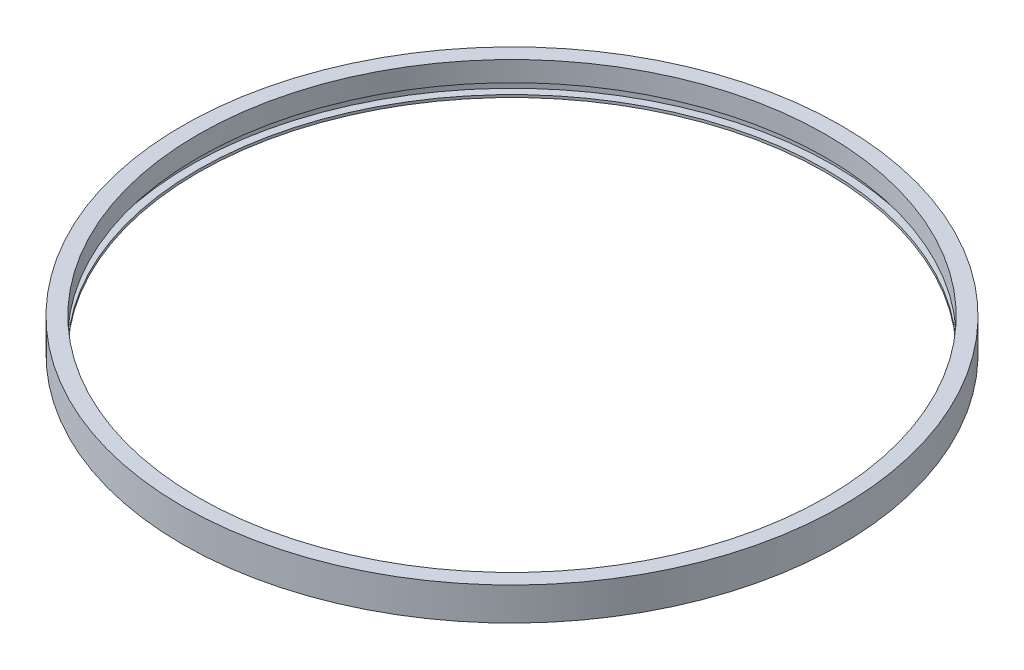
ISO-10303-21;
HEADER;
FILE_DESCRIPTION(('STEP AP214'),'2;1');
FILE_NAME('part.step','',(''),(''),'','','');
FILE_SCHEMA(('AUTOMOTIVE_DESIGN { 1 0 10303 214 1 1 1 1 }'));
ENDSEC;
DATA;
#1=APPLICATION_CONTEXT('core data for automotive mechanical design processes');
#2=APPLICATION_PROTOCOL_DEFINITION('international standard','automotive_design',2000,#1);
#3=PRODUCT_CONTEXT('',#1,'mechanical');
#4=PRODUCT('Part','Part','',(#3));
#5=PRODUCT_RELATED_PRODUCT_CATEGORY('part','',(#4));
#6=PRODUCT_DEFINITION_FORMATION('','',#4);
#7=PRODUCT_DEFINITION_CONTEXT('part definition',#1,'design');
#8=PRODUCT_DEFINITION('design','',#6,#7);
#9=PRODUCT_DEFINITION_SHAPE('','',#8);
#10=(LENGTH_UNIT() NAMED_UNIT(*) SI_UNIT(.MILLI.,.METRE.));
#11=(NAMED_UNIT(*) PLANE_ANGLE_UNIT() SI_UNIT($,.RADIAN.));
#12=(NAMED_UNIT(*) SI_UNIT($,.STERADIAN.) SOLID_ANGLE_UNIT());
#13=UNCERTAINTY_MEASURE_WITH_UNIT(LENGTH_MEASURE(1.E-05),#10,'distance_accuracy_value','');
#14=(GEOMETRIC_REPRESENTATION_CONTEXT(3) GLOBAL_UNCERTAINTY_ASSIGNED_CONTEXT((#13)) GLOBAL_UNIT_ASSIGNED_CONTEXT((#10,
#11,#12)) REPRESENTATION_CONTEXT('',''));
#15=CARTESIAN_POINT('',(0.,0.,0.));
#16=DIRECTION('',(0.,0.,1.));
#17=DIRECTION('',(1.,0.,0.));
#18=AXIS2_PLACEMENT_3D('',#15,#16,#17);
#19=CARTESIAN_POINT('',(0.,0.,0.));
#20=DIRECTION('',(0.,1.,0.));
#21=DIRECTION('',(0.,0.,1.));
#22=AXIS2_PLACEMENT_3D('',#19,#20,#21);
#23=PLANE('',#22);
#24=CARTESIAN_POINT('',(0.,0.,0.));
#25=DIRECTION('',(0.,1.,0.));
#26=DIRECTION('',(0.,0.,1.));
#27=AXIS2_PLACEMENT_3D('',#24,#25,#26);
#28=CIRCLE('',#27,61.);
#29=CARTESIAN_POINT('',(0.,0.,61.));
#30=VERTEX_POINT('',#29);
#31=EDGE_CURVE('E47',#30,#30,#28,.T.);
#32=ORIENTED_EDGE('',*,*,#31,.T.);
#33=EDGE_LOOP('',(#32));
#34=FACE_BOUND('',#33,.T.);
#35=CARTESIAN_POINT('',(0.,0.,0.));
#36=DIRECTION('',(0.,-1.,0.));
#37=DIRECTION('',(0.,0.,-1.));
#38=AXIS2_PLACEMENT_3D('',#35,#36,#37);
#39=CIRCLE('',#38,62.5);
#40=CARTESIAN_POINT('',(0.,0.,-62.5));
#41=VERTEX_POINT('',#40);
#42=EDGE_CURVE('E52',#41,#41,#39,.T.);
#43=ORIENTED_EDGE('',*,*,#42,.T.);
#44=EDGE_LOOP('',(#43));
#45=FACE_BOUND('',#44,.T.);
#46=ADVANCED_FACE('F36',(#34,#45),#23,.F.);
#47=CARTESIAN_POINT('',(0.,3.9,0.));
#48=DIRECTION('',(0.,1.,0.));
#49=DIRECTION('',(0.,0.,1.));
#50=AXIS2_PLACEMENT_3D('',#47,#48,#49);
#51=PLANE('',#50);
#52=CARTESIAN_POINT('',(0.,3.9,0.));
#53=DIRECTION('',(0.,1.,0.));
#54=DIRECTION('',(0.,0.,1.));
#55=AXIS2_PLACEMENT_3D('',#52,#53,#54);
#56=CIRCLE('',#55,64.);
#57=CARTESIAN_POINT('',(0.,3.9,64.));
#58=VERTEX_POINT('',#57);
#59=EDGE_CURVE('E10',#58,#58,#56,.T.);
#60=ORIENTED_EDGE('',*,*,#59,.T.);
#61=EDGE_LOOP('',(#60));
#62=FACE_BOUND('',#61,.T.);
#63=CARTESIAN_POINT('',(0.,3.9,0.));
#64=DIRECTION('',(0.,1.,0.));
#65=DIRECTION('',(0.,0.,1.));
#66=AXIS2_PLACEMENT_3D('',#63,#64,#65);
#67=CIRCLE('',#66,61.);
#68=CARTESIAN_POINT('',(0.,3.9,61.));
#69=VERTEX_POINT('',#68);
#70=EDGE_CURVE('E43',#69,#69,#67,.T.);
#71=ORIENTED_EDGE('',*,*,#70,.F.);
#72=EDGE_LOOP('',(#71));
#73=FACE_BOUND('',#72,.T.);
#74=ADVANCED_FACE('F86',(#62,#73),#51,.T.);
#75=CARTESIAN_POINT('',(0.,3.9,0.));
#76=DIRECTION('',(0.,-1.,0.));
#77=DIRECTION('',(0.,0.,-1.));
#78=AXIS2_PLACEMENT_3D('',#75,#76,#77);
#79=CYLINDRICAL_SURFACE('',#78,64.);
#80=ORIENTED_EDGE('',*,*,#59,.F.);
#81=EDGE_LOOP('',(#80));
#82=FACE_BOUND('',#81,.T.);
#83=CARTESIAN_POINT('',(0.,-2.5,0.));
#84=DIRECTION('',(0.,-1.,0.));
#85=DIRECTION('',(0.,0.,-1.));
#86=AXIS2_PLACEMENT_3D('',#83,#84,#85);
#87=CIRCLE('',#86,64.);
#88=CARTESIAN_POINT('',(0.,-2.5,-64.));
#89=VERTEX_POINT('',#88);
#90=EDGE_CURVE('E59',#89,#89,#87,.T.);
#91=ORIENTED_EDGE('',*,*,#90,.F.);
#92=EDGE_LOOP('',(#91));
#93=FACE_BOUND('',#92,.T.);
#94=ADVANCED_FACE('F38',(#82,#93),#79,.T.);
#95=CARTESIAN_POINT('',(0.,3.9,0.));
#96=DIRECTION('',(0.,-1.,0.));
#97=DIRECTION('',(0.,0.,-1.));
#98=AXIS2_PLACEMENT_3D('',#95,#96,#97);
#99=CYLINDRICAL_SURFACE('',#98,61.);
#100=ORIENTED_EDGE('',*,*,#70,.T.);
#101=EDGE_LOOP('',(#100));
#102=FACE_BOUND('',#101,.T.);
#103=ORIENTED_EDGE('',*,*,#31,.F.);
#104=EDGE_LOOP('',(#103));
#105=FACE_BOUND('',#104,.T.);
#106=ADVANCED_FACE('F94',(#102,#105),#99,.F.);
#107=CARTESIAN_POINT('',(0.,-2.,0.));
#108=DIRECTION('',(0.,1.,0.));
#109=DIRECTION('',(0.,0.,1.));
#110=AXIS2_PLACEMENT_3D('',#107,#108,#109);
#111=CYLINDRICAL_SURFACE('',#110,62.5);
#112=CARTESIAN_POINT('',(0.,-2.,0.));
#113=DIRECTION('',(0.,-1.,0.));
#114=DIRECTION('',(0.,0.,-1.));
#115=AXIS2_PLACEMENT_3D('',#112,#113,#114);
#116=CIRCLE('',#115,62.5);
#117=CARTESIAN_POINT('',(0.,-2.,-62.5));
#118=VERTEX_POINT('',#117);
#119=EDGE_CURVE('E56',#118,#118,#116,.T.);
#120=ORIENTED_EDGE('',*,*,#119,.T.);
#121=EDGE_LOOP('',(#120));
#122=FACE_BOUND('',#121,.T.);
#123=ORIENTED_EDGE('',*,*,#42,.F.);
#124=EDGE_LOOP('',(#123));
#125=FACE_BOUND('',#124,.T.);
#126=ADVANCED_FACE('F82',(#122,#125),#111,.F.);
#127=CARTESIAN_POINT('',(0.,-2.,0.));
#128=DIRECTION('',(0.,-1.,0.));
#129=DIRECTION('',(0.,0.,-1.));
#130=AXIS2_PLACEMENT_3D('',#127,#128,#129);
#131=PLANE('',#130);
#132=CARTESIAN_POINT('',(0.,-2.,0.));
#133=DIRECTION('',(0.,-1.,0.));
#134=DIRECTION('',(0.,0.,-1.));
#135=AXIS2_PLACEMENT_3D('',#132,#133,#134);
#136=CIRCLE('',#135,61.);
#137=CARTESIAN_POINT('',(0.,-2.,-61.));
#138=VERTEX_POINT('',#137);
#139=EDGE_CURVE('E63',#138,#138,#136,.T.);
#140=ORIENTED_EDGE('',*,*,#139,.T.);
#141=EDGE_LOOP('',(#140));
#142=FACE_BOUND('',#141,.T.);
#143=ORIENTED_EDGE('',*,*,#119,.F.);
#144=EDGE_LOOP('',(#143));
#145=FACE_BOUND('',#144,.T.);
#146=ADVANCED_FACE('F74',(#142,#145),#131,.F.);
#147=CARTESIAN_POINT('',(0.,-2.5,0.));
#148=DIRECTION('',(0.,-1.,0.));
#149=DIRECTION('',(0.,0.,-1.));
#150=AXIS2_PLACEMENT_3D('',#147,#148,#149);
#151=PLANE('',#150);
#152=ORIENTED_EDGE('',*,*,#90,.T.);
#153=EDGE_LOOP('',(#152));
#154=FACE_BOUND('',#153,.T.);
#155=CARTESIAN_POINT('',(0.,-2.5,0.));
#156=DIRECTION('',(0.,-1.,0.));
#157=DIRECTION('',(0.,0.,-1.));
#158=AXIS2_PLACEMENT_3D('',#155,#156,#157);
#159=CIRCLE('',#158,61.);
#160=CARTESIAN_POINT('',(0.,-2.5,-61.));
#161=VERTEX_POINT('',#160);
#162=EDGE_CURVE('E62',#161,#161,#159,.T.);
#163=ORIENTED_EDGE('',*,*,#162,.F.);
#164=EDGE_LOOP('',(#163));
#165=FACE_BOUND('',#164,.T.);
#166=ADVANCED_FACE('F72',(#154,#165),#151,.T.);
#167=CARTESIAN_POINT('',(0.,-2.5,0.));
#168=DIRECTION('',(0.,1.,0.));
#169=DIRECTION('',(0.,0.,1.));
#170=AXIS2_PLACEMENT_3D('',#167,#168,#169);
#171=CYLINDRICAL_SURFACE('',#170,61.);
#172=ORIENTED_EDGE('',*,*,#162,.T.);
#173=EDGE_LOOP('',(#172));
#174=FACE_BOUND('',#173,.T.);
#175=ORIENTED_EDGE('',*,*,#139,.F.);
#176=EDGE_LOOP('',(#175));
#177=FACE_BOUND('',#176,.T.);
#178=ADVANCED_FACE('F69',(#174,#177),#171,.F.);
#179=CLOSED_SHELL('',(#46,#74,#94,#106,#126,#146,#166,#178));
#180=MANIFOLD_SOLID_BREP('B2',#179);
#181=ADVANCED_BREP_SHAPE_REPRESENTATION('',(#18,#180),#14);
#182=SHAPE_DEFINITION_REPRESENTATION(#9,#181);
ENDSEC;
END-ISO-10303-21;
